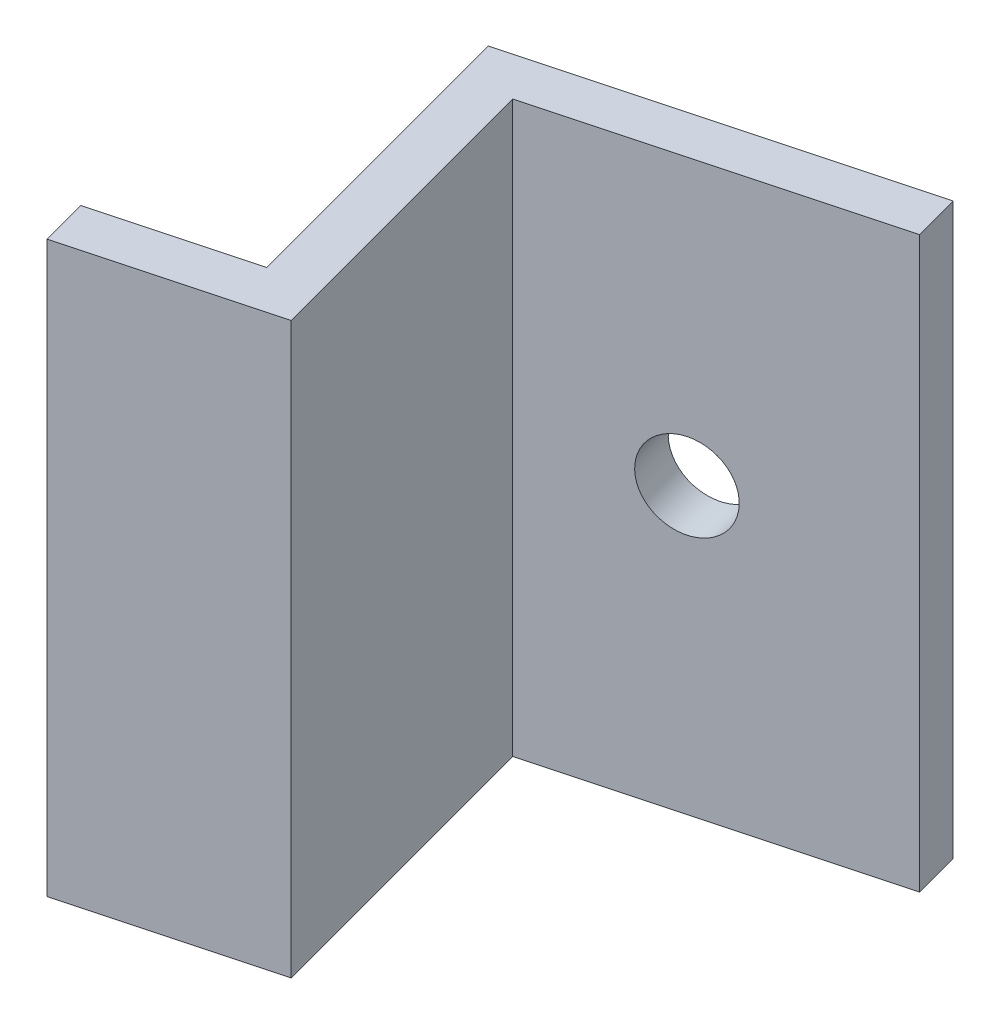
ISO-10303-21;
HEADER;
FILE_DESCRIPTION(('STEP AP214'),'2;1');
FILE_NAME('part.step','',(''),(''),'','','');
FILE_SCHEMA(('AUTOMOTIVE_DESIGN { 1 0 10303 214 1 1 1 1 }'));
ENDSEC;
DATA;
#1=APPLICATION_CONTEXT('core data for automotive mechanical design processes');
#2=APPLICATION_PROTOCOL_DEFINITION('international standard','automotive_design',2000,#1);
#3=PRODUCT_CONTEXT('',#1,'mechanical');
#4=PRODUCT('Part','Part','',(#3));
#5=PRODUCT_RELATED_PRODUCT_CATEGORY('part','',(#4));
#6=PRODUCT_DEFINITION_FORMATION('','',#4);
#7=PRODUCT_DEFINITION_CONTEXT('part definition',#1,'design');
#8=PRODUCT_DEFINITION('design','',#6,#7);
#9=PRODUCT_DEFINITION_SHAPE('','',#8);
#10=(LENGTH_UNIT() NAMED_UNIT(*) SI_UNIT(.MILLI.,.METRE.));
#11=(NAMED_UNIT(*) PLANE_ANGLE_UNIT() SI_UNIT($,.RADIAN.));
#12=(NAMED_UNIT(*) SI_UNIT($,.STERADIAN.) SOLID_ANGLE_UNIT());
#13=UNCERTAINTY_MEASURE_WITH_UNIT(LENGTH_MEASURE(1.E-05),#10,'distance_accuracy_value','');
#14=(GEOMETRIC_REPRESENTATION_CONTEXT(3) GLOBAL_UNCERTAINTY_ASSIGNED_CONTEXT((#13)) GLOBAL_UNIT_ASSIGNED_CONTEXT((#10,
#11,#12)) REPRESENTATION_CONTEXT('',''));
#15=CARTESIAN_POINT('',(0.,0.,0.));
#16=DIRECTION('',(0.,0.,1.));
#17=DIRECTION('',(1.,0.,0.));
#18=AXIS2_PLACEMENT_3D('',#15,#16,#17);
#19=CARTESIAN_POINT('',(1289.078285252,1794.,2392.556489899));
#20=DIRECTION('',(-0.258819045102985,0.,-0.965925826288944));
#21=DIRECTION('',(0.,1.,0.));
#22=AXIS2_PLACEMENT_3D('',#19,#20,#21);
#23=CYLINDRICAL_SURFACE('',#22,4.5);
#24=CARTESIAN_POINT('',(1289.104167157,1794.,2392.653082481));
#25=DIRECTION('',(-0.258819045102985,0.,-0.965925826288944));
#26=DIRECTION('',(0.,1.,0.));
#27=AXIS2_PLACEMENT_3D('',#24,#25,#26);
#28=CIRCLE('',#27,4.5);
#29=CARTESIAN_POINT('',(1289.104167157,1798.5,2392.653082481));
#30=VERTEX_POINT('',#29);
#31=EDGE_CURVE('E160',#30,#30,#28,.T.);
#32=ORIENTED_EDGE('',*,*,#31,.T.);
#33=DIRECTION('',(0.258819045102985,0.,0.965925826288944));
#34=VECTOR('',#33,1.);
#35=CARTESIAN_POINT('',(1289.078285252,1798.5,2392.556489899));
#36=LINE('',#35,#34);
#37=CARTESIAN_POINT('',(1290.398262382,1798.5,2397.482711613));
#38=VERTEX_POINT('',#37);
#39=EDGE_CURVE('E11',#30,#38,#36,.T.);
#40=ORIENTED_EDGE('',*,*,#39,.T.);
#41=CARTESIAN_POINT('',(1290.398262382,1794.,2397.482711613));
#42=DIRECTION('',(-0.258819045102985,0.,-0.965925826288944));
#43=DIRECTION('',(0.,1.,0.));
#44=AXIS2_PLACEMENT_3D('',#41,#42,#43);
#45=CIRCLE('',#44,4.5);
#46=EDGE_CURVE('E27',#38,#38,#45,.T.);
#47=ORIENTED_EDGE('',*,*,#46,.F.);
#48=ORIENTED_EDGE('',*,*,#39,.F.);
#49=EDGE_LOOP('',(#32,#40,#47,#48));
#50=FACE_BOUND('',#49,.T.);
#51=ADVANCED_FACE('F17',(#50),#23,.F.);
#52=CARTESIAN_POINT('',(1308.422683683,1824.,2387.476701579));
#53=DIRECTION('',(0.,1.,0.));
#54=DIRECTION('',(1.,0.,0.));
#55=AXIS2_PLACEMENT_3D('',#52,#53,#54);
#56=PLANE('',#55);
#57=DIRECTION('',(0.258819045102985,0.,0.965925826288944));
#58=VECTOR('',#57,1.);
#59=CARTESIAN_POINT('',(1308.422683683,1824.,2387.476701579));
#60=LINE('',#59,#58);
#61=CARTESIAN_POINT('',(1308.422683683,1824.,2387.476701579));
#62=VERTEX_POINT('',#61);
#63=CARTESIAN_POINT('',(1309.716778908,1824.,2392.306330711));
#64=VERTEX_POINT('',#63);
#65=EDGE_CURVE('E139',#62,#64,#60,.T.);
#66=ORIENTED_EDGE('',*,*,#65,.F.);
#67=DIRECTION('',(-0.965925826288944,0.,0.258819045102985));
#68=VECTOR('',#67,1.);
#69=CARTESIAN_POINT('',(1308.422683683,1824.,2387.476701579));
#70=LINE('',#69,#68);
#71=CARTESIAN_POINT('',(1269.785650631,1824.,2397.829463383));
#72=VERTEX_POINT('',#71);
#73=EDGE_CURVE('E123',#62,#72,#70,.T.);
#74=ORIENTED_EDGE('',*,*,#73,.T.);
#75=DIRECTION('',(-0.258819045102985,0.,-0.965925826288944));
#76=VECTOR('',#75,1.);
#77=CARTESIAN_POINT('',(1278.326679119,1824.,2429.705015651));
#78=LINE('',#77,#76);
#79=CARTESIAN_POINT('',(1278.326679119,1824.,2429.705015651));
#80=VERTEX_POINT('',#79);
#81=EDGE_CURVE('E159',#80,#72,#78,.T.);
#82=ORIENTED_EDGE('',*,*,#81,.F.);
#83=DIRECTION('',(-0.965925826288944,0.,0.258819045102985));
#84=VECTOR('',#83,1.);
#85=CARTESIAN_POINT('',(1283.156308251,1824.,2428.410920425));
#86=LINE('',#85,#84);
#87=CARTESIAN_POINT('',(1262.871865899,1824.,2433.846120372));
#88=VERTEX_POINT('',#87);
#89=EDGE_CURVE('E70',#80,#88,#86,.T.);
#90=ORIENTED_EDGE('',*,*,#89,.T.);
#91=DIRECTION('',(0.258819045102985,0.,0.965925826288944));
#92=VECTOR('',#91,1.);
#93=CARTESIAN_POINT('',(1262.871865899,1824.,2433.846120372));
#94=LINE('',#93,#92);
#95=CARTESIAN_POINT('',(1264.165961124,1824.,2438.675749504));
#96=VERTEX_POINT('',#95);
#97=EDGE_CURVE('E182',#88,#96,#94,.T.);
#98=ORIENTED_EDGE('',*,*,#97,.T.);
#99=DIRECTION('',(0.965925826288944,0.,-0.258819045102985));
#100=VECTOR('',#99,1.);
#101=CARTESIAN_POINT('',(1264.165961124,1824.,2438.675749504));
#102=LINE('',#101,#100);
#103=CARTESIAN_POINT('',(1284.450403476,1824.,2433.240549557));
#104=VERTEX_POINT('',#103);
#105=EDGE_CURVE('E190',#96,#104,#102,.T.);
#106=ORIENTED_EDGE('',*,*,#105,.T.);
#107=DIRECTION('',(-0.258819045102985,0.,-0.965925826288944));
#108=VECTOR('',#107,1.);
#109=CARTESIAN_POINT('',(1284.450403476,1824.,2433.240549557));
#110=LINE('',#109,#108);
#111=CARTESIAN_POINT('',(1275.909374988,1824.,2401.364997289));
#112=VERTEX_POINT('',#111);
#113=EDGE_CURVE('E193',#104,#112,#110,.T.);
#114=ORIENTED_EDGE('',*,*,#113,.T.);
#115=DIRECTION('',(-0.965925826288944,0.,0.258819045102985));
#116=VECTOR('',#115,1.);
#117=CARTESIAN_POINT('',(1309.716778908,1824.,2392.306330711));
#118=LINE('',#117,#116);
#119=EDGE_CURVE('E161',#64,#112,#118,.T.);
#120=ORIENTED_EDGE('',*,*,#119,.F.);
#121=EDGE_LOOP('',(#66,#74,#82,#90,#98,#106,#114,#120));
#122=FACE_BOUND('',#121,.T.);
#123=ADVANCED_FACE('F19',(#122),#56,.T.);
#124=CARTESIAN_POINT('',(1309.716778908,1764.,2392.306330711));
#125=DIRECTION('',(0.258819045102985,0.,0.965925826288944));
#126=DIRECTION('',(0.,-1.,0.));
#127=AXIS2_PLACEMENT_3D('',#124,#125,#126);
#128=PLANE('',#127);
#129=ORIENTED_EDGE('',*,*,#46,.T.);
#130=EDGE_LOOP('',(#129));
#131=FACE_BOUND('',#130,.T.);
#132=DIRECTION('',(-0.965925826288944,0.,0.258819045102985));
#133=VECTOR('',#132,1.);
#134=CARTESIAN_POINT('',(1309.716778908,1764.,2392.306330711));
#135=LINE('',#134,#133);
#136=CARTESIAN_POINT('',(1309.716778908,1764.,2392.306330711));
#137=VERTEX_POINT('',#136);
#138=CARTESIAN_POINT('',(1275.909374988,1764.,2401.364997289));
#139=VERTEX_POINT('',#138);
#140=EDGE_CURVE('E243',#137,#139,#135,.T.);
#141=ORIENTED_EDGE('',*,*,#140,.F.);
#142=DIRECTION('',(0.,1.,0.));
#143=VECTOR('',#142,1.);
#144=CARTESIAN_POINT('',(1309.716778908,1764.,2392.306330711));
#145=LINE('',#144,#143);
#146=EDGE_CURVE('E128',#137,#64,#145,.T.);
#147=ORIENTED_EDGE('',*,*,#146,.T.);
#148=ORIENTED_EDGE('',*,*,#119,.T.);
#149=DIRECTION('',(0.,1.,0.));
#150=VECTOR('',#149,1.);
#151=CARTESIAN_POINT('',(1275.909374988,1764.,2401.364997289));
#152=LINE('',#151,#150);
#153=EDGE_CURVE('E164',#139,#112,#152,.T.);
#154=ORIENTED_EDGE('',*,*,#153,.F.);
#155=EDGE_LOOP('',(#141,#147,#148,#154));
#156=FACE_BOUND('',#155,.T.);
#157=ADVANCED_FACE('F197',(#131,#156),#128,.T.);
#158=CARTESIAN_POINT('',(1275.909374988,1764.,2401.364997289));
#159=DIRECTION('',(-0.965925826288944,0.,0.258819045102985));
#160=DIRECTION('',(0.,1.,0.));
#161=AXIS2_PLACEMENT_3D('',#158,#159,#160);
#162=PLANE('',#161);
#163=ORIENTED_EDGE('',*,*,#113,.F.);
#164=DIRECTION('',(0.,1.,0.));
#165=VECTOR('',#164,1.);
#166=CARTESIAN_POINT('',(1284.450403476,1764.,2433.240549557));
#167=LINE('',#166,#165);
#168=CARTESIAN_POINT('',(1284.450403476,1764.,2433.240549557));
#169=VERTEX_POINT('',#168);
#170=EDGE_CURVE('E186',#169,#104,#167,.T.);
#171=ORIENTED_EDGE('',*,*,#170,.F.);
#172=DIRECTION('',(0.258819045102985,0.,0.965925826288944));
#173=VECTOR('',#172,1.);
#174=CARTESIAN_POINT('',(1275.909374988,1764.,2401.364997289));
#175=LINE('',#174,#173);
#176=EDGE_CURVE('E240',#139,#169,#175,.T.);
#177=ORIENTED_EDGE('',*,*,#176,.F.);
#178=ORIENTED_EDGE('',*,*,#153,.T.);
#179=EDGE_LOOP('',(#163,#171,#177,#178));
#180=FACE_BOUND('',#179,.T.);
#181=ADVANCED_FACE('F225',(#180),#162,.F.);
#182=CARTESIAN_POINT('',(1284.450403476,1764.,2433.240549557));
#183=DIRECTION('',(0.258819045102985,0.,0.965925826288944));
#184=DIRECTION('',(0.,-1.,0.));
#185=AXIS2_PLACEMENT_3D('',#182,#183,#184);
#186=PLANE('',#185);
#187=DIRECTION('',(-0.965925826288944,0.,0.258819045102985));
#188=VECTOR('',#187,1.);
#189=CARTESIAN_POINT('',(1284.450403476,1764.,2433.240549557));
#190=LINE('',#189,#188);
#191=CARTESIAN_POINT('',(1264.165961124,1764.,2438.675749504));
#192=VERTEX_POINT('',#191);
#193=EDGE_CURVE('E234',#169,#192,#190,.T.);
#194=ORIENTED_EDGE('',*,*,#193,.F.);
#195=ORIENTED_EDGE('',*,*,#170,.T.);
#196=ORIENTED_EDGE('',*,*,#105,.F.);
#197=DIRECTION('',(0.,1.,0.));
#198=VECTOR('',#197,1.);
#199=CARTESIAN_POINT('',(1264.165961124,1764.,2438.675749504));
#200=LINE('',#199,#198);
#201=EDGE_CURVE('E178',#192,#96,#200,.T.);
#202=ORIENTED_EDGE('',*,*,#201,.F.);
#203=EDGE_LOOP('',(#194,#195,#196,#202));
#204=FACE_BOUND('',#203,.T.);
#205=ADVANCED_FACE('F222',(#204),#186,.T.);
#206=CARTESIAN_POINT('',(1262.871865899,1764.,2433.846120372));
#207=DIRECTION('',(-0.965925826288944,0.,0.258819045102985));
#208=DIRECTION('',(0.,1.,0.));
#209=AXIS2_PLACEMENT_3D('',#206,#207,#208);
#210=PLANE('',#209);
#211=DIRECTION('',(0.,1.,0.));
#212=VECTOR('',#211,1.);
#213=CARTESIAN_POINT('',(1262.871865899,1764.,2433.846120372));
#214=LINE('',#213,#212);
#215=CARTESIAN_POINT('',(1262.871865899,1764.,2433.846120372));
#216=VERTEX_POINT('',#215);
#217=EDGE_CURVE('E175',#216,#88,#214,.T.);
#218=ORIENTED_EDGE('',*,*,#217,.F.);
#219=DIRECTION('',(0.258819045102985,0.,0.965925826288944));
#220=VECTOR('',#219,1.);
#221=CARTESIAN_POINT('',(1262.871865899,1764.,2433.846120372));
#222=LINE('',#221,#220);
#223=EDGE_CURVE('E239',#216,#192,#222,.T.);
#224=ORIENTED_EDGE('',*,*,#223,.T.);
#225=ORIENTED_EDGE('',*,*,#201,.T.);
#226=ORIENTED_EDGE('',*,*,#97,.F.);
#227=EDGE_LOOP('',(#218,#224,#225,#226));
#228=FACE_BOUND('',#227,.T.);
#229=ADVANCED_FACE('F220',(#228),#210,.T.);
#230=CARTESIAN_POINT('',(1283.156308251,1764.,2428.410920425));
#231=DIRECTION('',(0.258819045102985,0.,0.965925826288944));
#232=DIRECTION('',(0.,-1.,0.));
#233=AXIS2_PLACEMENT_3D('',#230,#231,#232);
#234=PLANE('',#233);
#235=ORIENTED_EDGE('',*,*,#217,.T.);
#236=ORIENTED_EDGE('',*,*,#89,.F.);
#237=DIRECTION('',(0.,1.,0.));
#238=VECTOR('',#237,1.);
#239=CARTESIAN_POINT('',(1278.326679119,1764.,2429.705015651));
#240=LINE('',#239,#238);
#241=CARTESIAN_POINT('',(1278.326679119,1764.,2429.705015651));
#242=VERTEX_POINT('',#241);
#243=EDGE_CURVE('E155',#242,#80,#240,.T.);
#244=ORIENTED_EDGE('',*,*,#243,.F.);
#245=DIRECTION('',(-0.965925826288944,0.,0.258819045102985));
#246=VECTOR('',#245,1.);
#247=CARTESIAN_POINT('',(1283.156308251,1764.,2428.410920425));
#248=LINE('',#247,#246);
#249=EDGE_CURVE('E150',#242,#216,#248,.T.);
#250=ORIENTED_EDGE('',*,*,#249,.T.);
#251=EDGE_LOOP('',(#235,#236,#244,#250));
#252=FACE_BOUND('',#251,.T.);
#253=ADVANCED_FACE('F217',(#252),#234,.F.);
#254=CARTESIAN_POINT('',(1269.785650631,1764.,2397.829463383));
#255=DIRECTION('',(-0.965925826288944,0.,0.258819045102985));
#256=DIRECTION('',(0.,1.,0.));
#257=AXIS2_PLACEMENT_3D('',#254,#255,#256);
#258=PLANE('',#257);
#259=DIRECTION('',(0.,1.,0.));
#260=VECTOR('',#259,1.);
#261=CARTESIAN_POINT('',(1269.785650631,1764.,2397.829463383));
#262=LINE('',#261,#260);
#263=CARTESIAN_POINT('',(1269.785650631,1764.,2397.829463383));
#264=VERTEX_POINT('',#263);
#265=EDGE_CURVE('E110',#264,#72,#262,.T.);
#266=ORIENTED_EDGE('',*,*,#265,.F.);
#267=DIRECTION('',(-0.258819045102985,0.,-0.965925826288944));
#268=VECTOR('',#267,1.);
#269=CARTESIAN_POINT('',(1278.326679119,1764.,2429.705015651));
#270=LINE('',#269,#268);
#271=EDGE_CURVE('E143',#242,#264,#270,.T.);
#272=ORIENTED_EDGE('',*,*,#271,.F.);
#273=ORIENTED_EDGE('',*,*,#243,.T.);
#274=ORIENTED_EDGE('',*,*,#81,.T.);
#275=EDGE_LOOP('',(#266,#272,#273,#274));
#276=FACE_BOUND('',#275,.T.);
#277=ADVANCED_FACE('F213',(#276),#258,.T.);
#278=CARTESIAN_POINT('',(1308.422683683,1764.,2387.476701579));
#279=DIRECTION('',(0.258819045102985,0.,0.965925826288944));
#280=DIRECTION('',(0.,-1.,0.));
#281=AXIS2_PLACEMENT_3D('',#278,#279,#280);
#282=PLANE('',#281);
#283=ORIENTED_EDGE('',*,*,#31,.F.);
#284=EDGE_LOOP('',(#283));
#285=FACE_BOUND('',#284,.T.);
#286=ORIENTED_EDGE('',*,*,#265,.T.);
#287=ORIENTED_EDGE('',*,*,#73,.F.);
#288=DIRECTION('',(0.,1.,0.));
#289=VECTOR('',#288,1.);
#290=CARTESIAN_POINT('',(1308.422683683,1764.,2387.476701579));
#291=LINE('',#290,#289);
#292=CARTESIAN_POINT('',(1308.422683683,1764.,2387.476701579));
#293=VERTEX_POINT('',#292);
#294=EDGE_CURVE('E116',#293,#62,#291,.T.);
#295=ORIENTED_EDGE('',*,*,#294,.F.);
#296=DIRECTION('',(-0.965925826288944,0.,0.258819045102985));
#297=VECTOR('',#296,1.);
#298=CARTESIAN_POINT('',(1308.422683683,1764.,2387.476701579));
#299=LINE('',#298,#297);
#300=EDGE_CURVE('E120',#293,#264,#299,.T.);
#301=ORIENTED_EDGE('',*,*,#300,.T.);
#302=EDGE_LOOP('',(#286,#287,#295,#301));
#303=FACE_BOUND('',#302,.T.);
#304=ADVANCED_FACE('F118',(#285,#303),#282,.F.);
#305=CARTESIAN_POINT('',(1308.422683683,1764.,2387.476701579));
#306=DIRECTION('',(-0.965925826288944,0.,0.258819045102985));
#307=DIRECTION('',(0.,1.,0.));
#308=AXIS2_PLACEMENT_3D('',#305,#306,#307);
#309=PLANE('',#308);
#310=ORIENTED_EDGE('',*,*,#65,.T.);
#311=ORIENTED_EDGE('',*,*,#146,.F.);
#312=DIRECTION('',(0.258819045102985,0.,0.965925826288944));
#313=VECTOR('',#312,1.);
#314=CARTESIAN_POINT('',(1308.422683683,1764.,2387.476701579));
#315=LINE('',#314,#313);
#316=EDGE_CURVE('E132',#293,#137,#315,.T.);
#317=ORIENTED_EDGE('',*,*,#316,.F.);
#318=ORIENTED_EDGE('',*,*,#294,.T.);
#319=EDGE_LOOP('',(#310,#311,#317,#318));
#320=FACE_BOUND('',#319,.T.);
#321=ADVANCED_FACE('F133',(#320),#309,.F.);
#322=CARTESIAN_POINT('',(1308.422683683,1764.,2387.476701579));
#323=DIRECTION('',(0.,1.,0.));
#324=DIRECTION('',(1.,0.,0.));
#325=AXIS2_PLACEMENT_3D('',#322,#323,#324);
#326=PLANE('',#325);
#327=ORIENTED_EDGE('',*,*,#140,.T.);
#328=ORIENTED_EDGE('',*,*,#176,.T.);
#329=ORIENTED_EDGE('',*,*,#193,.T.);
#330=ORIENTED_EDGE('',*,*,#223,.F.);
#331=ORIENTED_EDGE('',*,*,#249,.F.);
#332=ORIENTED_EDGE('',*,*,#271,.T.);
#333=ORIENTED_EDGE('',*,*,#300,.F.);
#334=ORIENTED_EDGE('',*,*,#316,.T.);
#335=EDGE_LOOP('',(#327,#328,#329,#330,#331,#332,#333,#334));
#336=FACE_BOUND('',#335,.T.);
#337=ADVANCED_FACE('F141',(#336),#326,.F.);
#338=CLOSED_SHELL('',(#51,#123,#157,#181,#205,#229,#253,#277,#304,#321,#337));
#339=MANIFOLD_SOLID_BREP('B1',#338);
#340=ADVANCED_BREP_SHAPE_REPRESENTATION('',(#18,#339),#14);
#341=SHAPE_DEFINITION_REPRESENTATION(#9,#340);
ENDSEC;
END-ISO-10303-21;
